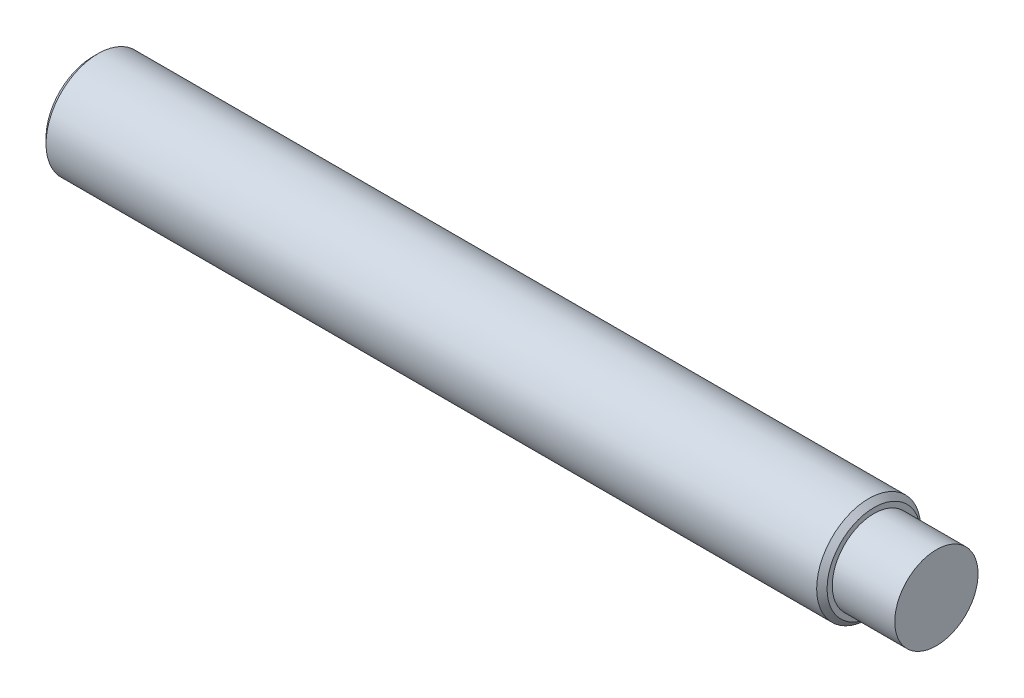
ISO-10303-21;
HEADER;
FILE_DESCRIPTION(('STEP AP214'),'2;1');
FILE_NAME('part.step','',(''),(''),'','','');
FILE_SCHEMA(('AUTOMOTIVE_DESIGN { 1 0 10303 214 1 1 1 1 }'));
ENDSEC;
DATA;
#1=APPLICATION_CONTEXT('core data for automotive mechanical design processes');
#2=APPLICATION_PROTOCOL_DEFINITION('international standard','automotive_design',2000,#1);
#3=PRODUCT_CONTEXT('',#1,'mechanical');
#4=PRODUCT('Part','Part','',(#3));
#5=PRODUCT_RELATED_PRODUCT_CATEGORY('part','',(#4));
#6=PRODUCT_DEFINITION_FORMATION('','',#4);
#7=PRODUCT_DEFINITION_CONTEXT('part definition',#1,'design');
#8=PRODUCT_DEFINITION('design','',#6,#7);
#9=PRODUCT_DEFINITION_SHAPE('','',#8);
#10=(LENGTH_UNIT() NAMED_UNIT(*) SI_UNIT(.MILLI.,.METRE.));
#11=(NAMED_UNIT(*) PLANE_ANGLE_UNIT() SI_UNIT($,.RADIAN.));
#12=(NAMED_UNIT(*) SI_UNIT($,.STERADIAN.) SOLID_ANGLE_UNIT());
#13=UNCERTAINTY_MEASURE_WITH_UNIT(LENGTH_MEASURE(1.E-05),#10,'distance_accuracy_value','');
#14=(GEOMETRIC_REPRESENTATION_CONTEXT(3) GLOBAL_UNCERTAINTY_ASSIGNED_CONTEXT((#13)) GLOBAL_UNIT_ASSIGNED_CONTEXT((#10,
#11,#12)) REPRESENTATION_CONTEXT('',''));
#15=CARTESIAN_POINT('',(0.,0.,0.));
#16=DIRECTION('',(0.,0.,1.));
#17=DIRECTION('',(1.,0.,0.));
#18=AXIS2_PLACEMENT_3D('',#15,#16,#17);
#19=CARTESIAN_POINT('',(0.,0.,0.));
#20=DIRECTION('',(1.,0.,0.));
#21=DIRECTION('',(0.,0.,-1.));
#22=AXIS2_PLACEMENT_3D('',#19,#20,#21);
#23=PLANE('',#22);
#24=CARTESIAN_POINT('',(0.,0.,0.));
#25=DIRECTION('',(-1.,0.,0.));
#26=DIRECTION('',(0.,0.,1.));
#27=AXIS2_PLACEMENT_3D('',#24,#25,#26);
#28=CIRCLE('',#27,3.);
#29=CARTESIAN_POINT('',(0.,0.,3.));
#30=VERTEX_POINT('',#29);
#31=EDGE_CURVE('E73',#30,#30,#28,.T.);
#32=ORIENTED_EDGE('',*,*,#31,.F.);
#33=EDGE_LOOP('',(#32));
#34=FACE_BOUND('',#33,.T.);
#35=CARTESIAN_POINT('',(0.,0.,0.));
#36=DIRECTION('',(1.,0.,0.));
#37=DIRECTION('',(0.,0.,-1.));
#38=AXIS2_PLACEMENT_3D('',#35,#36,#37);
#39=CIRCLE('',#38,4.5);
#40=CARTESIAN_POINT('',(0.,0.,-4.5));
#41=VERTEX_POINT('',#40);
#42=EDGE_CURVE('E10',#41,#41,#39,.F.);
#43=ORIENTED_EDGE('',*,*,#42,.T.);
#44=EDGE_LOOP('',(#43));
#45=FACE_BOUND('',#44,.T.);
#46=ADVANCED_FACE('F39',(#34,#45),#23,.F.);
#47=CARTESIAN_POINT('',(-21.6251223316182,0.,0.));
#48=DIRECTION('',(-1.,0.,0.));
#49=DIRECTION('',(0.,0.,1.));
#50=AXIS2_PLACEMENT_3D('',#47,#48,#49);
#51=CYLINDRICAL_SURFACE('',#50,5.);
#52=CARTESIAN_POINT('',(74.5,0.,0.));
#53=DIRECTION('',(-1.,0.,0.));
#54=DIRECTION('',(0.,0.,1.));
#55=AXIS2_PLACEMENT_3D('',#52,#53,#54);
#56=CIRCLE('',#55,5.);
#57=CARTESIAN_POINT('',(74.5,0.,5.));
#58=VERTEX_POINT('',#57);
#59=EDGE_CURVE('E53',#58,#58,#56,.T.);
#60=ORIENTED_EDGE('',*,*,#59,.T.);
#61=EDGE_LOOP('',(#60));
#62=FACE_BOUND('',#61,.T.);
#63=CARTESIAN_POINT('',(0.500000000000014,0.,0.));
#64=DIRECTION('',(1.,0.,0.));
#65=DIRECTION('',(0.,0.,-1.));
#66=AXIS2_PLACEMENT_3D('',#63,#64,#65);
#67=CIRCLE('',#66,5.);
#68=CARTESIAN_POINT('',(0.500000000000014,0.,-5.));
#69=VERTEX_POINT('',#68);
#70=EDGE_CURVE('E58',#69,#69,#67,.T.);
#71=ORIENTED_EDGE('',*,*,#70,.T.);
#72=EDGE_LOOP('',(#71));
#73=FACE_BOUND('',#72,.T.);
#74=ADVANCED_FACE('F90',(#62,#73),#51,.T.);
#75=CARTESIAN_POINT('',(75.,5.,0.));
#76=DIRECTION('',(-1.,0.,0.));
#77=DIRECTION('',(0.,0.,1.));
#78=AXIS2_PLACEMENT_3D('',#75,#76,#77);
#79=PLANE('',#78);
#80=CARTESIAN_POINT('',(75.,0.,0.));
#81=DIRECTION('',(-1.,0.,0.));
#82=DIRECTION('',(0.,0.,1.));
#83=AXIS2_PLACEMENT_3D('',#80,#81,#82);
#84=CIRCLE('',#83,4.50000000000002);
#85=CARTESIAN_POINT('',(75.,0.,4.50000000000002));
#86=VERTEX_POINT('',#85);
#87=EDGE_CURVE('E48',#86,#86,#84,.F.);
#88=ORIENTED_EDGE('',*,*,#87,.T.);
#89=EDGE_LOOP('',(#88));
#90=FACE_BOUND('',#89,.T.);
#91=CARTESIAN_POINT('',(75.,0.,0.));
#92=DIRECTION('',(-1.,0.,0.));
#93=DIRECTION('',(0.,0.,1.));
#94=AXIS2_PLACEMENT_3D('',#91,#92,#93);
#95=CIRCLE('',#94,4.);
#96=CARTESIAN_POINT('',(75.,0.,4.));
#97=VERTEX_POINT('',#96);
#98=EDGE_CURVE('E64',#97,#97,#95,.T.);
#99=ORIENTED_EDGE('',*,*,#98,.T.);
#100=EDGE_LOOP('',(#99));
#101=FACE_BOUND('',#100,.T.);
#102=ADVANCED_FACE('F95',(#90,#101),#79,.F.);
#103=CARTESIAN_POINT('',(-21.6251223316182,0.,0.));
#104=DIRECTION('',(-1.,0.,0.));
#105=DIRECTION('',(0.,0.,1.));
#106=AXIS2_PLACEMENT_3D('',#103,#104,#105);
#107=CYLINDRICAL_SURFACE('',#106,4.);
#108=ORIENTED_EDGE('',*,*,#98,.F.);
#109=EDGE_LOOP('',(#108));
#110=FACE_BOUND('',#109,.T.);
#111=CARTESIAN_POINT('',(81.,0.,0.));
#112=DIRECTION('',(-1.,0.,0.));
#113=DIRECTION('',(0.,0.,1.));
#114=AXIS2_PLACEMENT_3D('',#111,#112,#113);
#115=CIRCLE('',#114,4.);
#116=CARTESIAN_POINT('',(81.,0.,4.));
#117=VERTEX_POINT('',#116);
#118=EDGE_CURVE('E68',#117,#117,#115,.T.);
#119=ORIENTED_EDGE('',*,*,#118,.T.);
#120=EDGE_LOOP('',(#119));
#121=FACE_BOUND('',#120,.T.);
#122=ADVANCED_FACE('F111',(#110,#121),#107,.T.);
#123=CARTESIAN_POINT('',(81.,4.,0.));
#124=DIRECTION('',(-1.,0.,0.));
#125=DIRECTION('',(0.,0.,1.));
#126=AXIS2_PLACEMENT_3D('',#123,#124,#125);
#127=PLANE('',#126);
#128=ORIENTED_EDGE('',*,*,#118,.F.);
#129=EDGE_LOOP('',(#128));
#130=FACE_BOUND('',#129,.T.);
#131=ADVANCED_FACE('F104',(#130),#127,.F.);
#132=CARTESIAN_POINT('',(74.5,0.,0.));
#133=DIRECTION('',(-1.,0.,0.));
#134=DIRECTION('',(0.,0.,1.));
#135=AXIS2_PLACEMENT_3D('',#132,#133,#134);
#136=CONICAL_SURFACE('',#135,5.,0.785398163397465);
#137=ORIENTED_EDGE('',*,*,#87,.F.);
#138=EDGE_LOOP('',(#137));
#139=FACE_BOUND('',#138,.T.);
#140=ORIENTED_EDGE('',*,*,#59,.F.);
#141=EDGE_LOOP('',(#140));
#142=FACE_BOUND('',#141,.T.);
#143=ADVANCED_FACE('F100',(#139,#142),#136,.T.);
#144=CARTESIAN_POINT('',(0.,0.,0.));
#145=DIRECTION('',(1.,0.,0.));
#146=DIRECTION('',(0.,0.,-1.));
#147=AXIS2_PLACEMENT_3D('',#144,#145,#146);
#148=CONICAL_SURFACE('',#147,4.5,0.78539816339743);
#149=ORIENTED_EDGE('',*,*,#70,.F.);
#150=EDGE_LOOP('',(#149));
#151=FACE_BOUND('',#150,.T.);
#152=ORIENTED_EDGE('',*,*,#42,.F.);
#153=EDGE_LOOP('',(#152));
#154=FACE_BOUND('',#153,.T.);
#155=ADVANCED_FACE('F42',(#151,#154),#148,.T.);
#156=CARTESIAN_POINT('',(10.,0.,0.));
#157=DIRECTION('',(-1.,0.,0.));
#158=DIRECTION('',(0.,0.,1.));
#159=AXIS2_PLACEMENT_3D('',#156,#157,#158);
#160=CYLINDRICAL_SURFACE('',#159,3.);
#161=CARTESIAN_POINT('',(10.,0.,0.));
#162=DIRECTION('',(-1.,0.,0.));
#163=DIRECTION('',(0.,0.,1.));
#164=AXIS2_PLACEMENT_3D('',#161,#162,#163);
#165=CIRCLE('',#164,3.);
#166=CARTESIAN_POINT('',(10.,0.,3.));
#167=VERTEX_POINT('',#166);
#168=EDGE_CURVE('E72',#167,#167,#165,.T.);
#169=ORIENTED_EDGE('',*,*,#168,.F.);
#170=EDGE_LOOP('',(#169));
#171=FACE_BOUND('',#170,.T.);
#172=ORIENTED_EDGE('',*,*,#31,.T.);
#173=EDGE_LOOP('',(#172));
#174=FACE_BOUND('',#173,.T.);
#175=ADVANCED_FACE('F83',(#171,#174),#160,.F.);
#176=CARTESIAN_POINT('',(10.,0.,0.));
#177=DIRECTION('',(-1.,0.,0.));
#178=DIRECTION('',(0.,0.,1.));
#179=AXIS2_PLACEMENT_3D('',#176,#177,#178);
#180=PLANE('',#179);
#181=ORIENTED_EDGE('',*,*,#168,.T.);
#182=EDGE_LOOP('',(#181));
#183=FACE_BOUND('',#182,.T.);
#184=ADVANCED_FACE('F81',(#183),#180,.T.);
#185=CLOSED_SHELL('',(#46,#74,#102,#122,#131,#143,#155,#175,#184));
#186=MANIFOLD_SOLID_BREP('B2',#185);
#187=ADVANCED_BREP_SHAPE_REPRESENTATION('',(#18,#186),#14);
#188=SHAPE_DEFINITION_REPRESENTATION(#9,#187);
ENDSEC;
END-ISO-10303-21;
